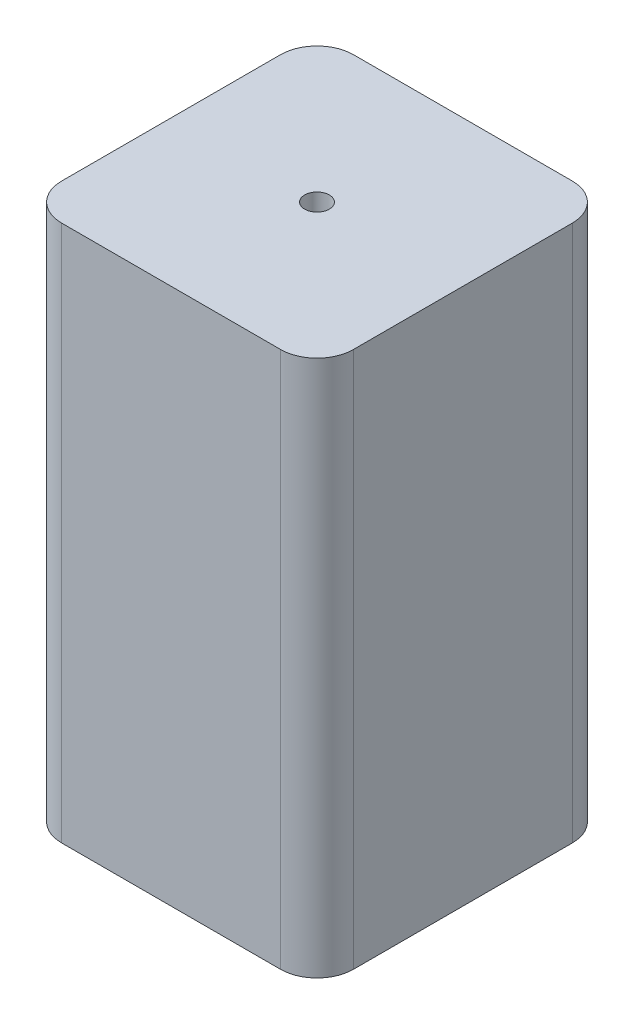
ISO-10303-21;
HEADER;
FILE_DESCRIPTION(('STEP AP214'),'2;1');
FILE_NAME('part.step','',(''),(''),'','','');
FILE_SCHEMA(('AUTOMOTIVE_DESIGN { 1 0 10303 214 1 1 1 1 }'));
ENDSEC;
DATA;
#1=APPLICATION_CONTEXT('core data for automotive mechanical design processes');
#2=APPLICATION_PROTOCOL_DEFINITION('international standard','automotive_design',2000,#1);
#3=PRODUCT_CONTEXT('',#1,'mechanical');
#4=PRODUCT('Part','Part','',(#3));
#5=PRODUCT_RELATED_PRODUCT_CATEGORY('part','',(#4));
#6=PRODUCT_DEFINITION_FORMATION('','',#4);
#7=PRODUCT_DEFINITION_CONTEXT('part definition',#1,'design');
#8=PRODUCT_DEFINITION('design','',#6,#7);
#9=PRODUCT_DEFINITION_SHAPE('','',#8);
#10=(LENGTH_UNIT() NAMED_UNIT(*) SI_UNIT(.MILLI.,.METRE.));
#11=(NAMED_UNIT(*) PLANE_ANGLE_UNIT() SI_UNIT($,.RADIAN.));
#12=(NAMED_UNIT(*) SI_UNIT($,.STERADIAN.) SOLID_ANGLE_UNIT());
#13=UNCERTAINTY_MEASURE_WITH_UNIT(LENGTH_MEASURE(1.E-05),#10,'distance_accuracy_value','');
#14=(GEOMETRIC_REPRESENTATION_CONTEXT(3) GLOBAL_UNCERTAINTY_ASSIGNED_CONTEXT((#13)) GLOBAL_UNIT_ASSIGNED_CONTEXT((#10,
#11,#12)) REPRESENTATION_CONTEXT('',''));
#15=CARTESIAN_POINT('',(0.,0.,0.));
#16=DIRECTION('',(0.,0.,1.));
#17=DIRECTION('',(1.,0.,0.));
#18=AXIS2_PLACEMENT_3D('',#15,#16,#17);
#19=CARTESIAN_POINT('',(-25.,92.,-25.));
#20=DIRECTION('',(1.,0.,0.));
#21=DIRECTION('',(0.,0.,-1.));
#22=AXIS2_PLACEMENT_3D('',#19,#20,#21);
#23=PLANE('',#22);
#24=DIRECTION('',(0.,0.,1.));
#25=VECTOR('',#24,1.);
#26=CARTESIAN_POINT('',(-25.,0.,-25.));
#27=LINE('',#26,#25);
#28=CARTESIAN_POINT('',(-25.,0.,-18.75));
#29=VERTEX_POINT('',#28);
#30=CARTESIAN_POINT('',(-25.,0.,18.75));
#31=VERTEX_POINT('',#30);
#32=EDGE_CURVE('E126',#29,#31,#27,.T.);
#33=ORIENTED_EDGE('',*,*,#32,.T.);
#34=DIRECTION('',(0.,-1.,0.));
#35=VECTOR('',#34,1.);
#36=CARTESIAN_POINT('',(-25.,92.,18.75));
#37=LINE('',#36,#35);
#38=CARTESIAN_POINT('',(-25.,92.,18.75));
#39=VERTEX_POINT('',#38);
#40=EDGE_CURVE('E104',#31,#39,#37,.F.);
#41=ORIENTED_EDGE('',*,*,#40,.T.);
#42=DIRECTION('',(0.,0.,1.));
#43=VECTOR('',#42,1.);
#44=CARTESIAN_POINT('',(-25.,92.,-25.));
#45=LINE('',#44,#43);
#46=CARTESIAN_POINT('',(-25.,92.,-18.75));
#47=VERTEX_POINT('',#46);
#48=EDGE_CURVE('E136',#47,#39,#45,.T.);
#49=ORIENTED_EDGE('',*,*,#48,.F.);
#50=DIRECTION('',(0.,-1.,0.));
#51=VECTOR('',#50,1.);
#52=CARTESIAN_POINT('',(-25.,92.,-18.75));
#53=LINE('',#52,#51);
#54=EDGE_CURVE('E109',#47,#29,#53,.T.);
#55=ORIENTED_EDGE('',*,*,#54,.T.);
#56=EDGE_LOOP('',(#33,#41,#49,#55));
#57=FACE_BOUND('',#56,.T.);
#58=ADVANCED_FACE('F33',(#57),#23,.F.);
#59=CARTESIAN_POINT('',(-25.,92.,25.));
#60=DIRECTION('',(0.,0.,-1.));
#61=DIRECTION('',(-1.,0.,0.));
#62=AXIS2_PLACEMENT_3D('',#59,#60,#61);
#63=PLANE('',#62);
#64=DIRECTION('',(1.,0.,0.));
#65=VECTOR('',#64,1.);
#66=CARTESIAN_POINT('',(-25.,92.,25.));
#67=LINE('',#66,#65);
#68=CARTESIAN_POINT('',(-18.75,92.,25.));
#69=VERTEX_POINT('',#68);
#70=CARTESIAN_POINT('',(18.75,92.,25.));
#71=VERTEX_POINT('',#70);
#72=EDGE_CURVE('E119',#69,#71,#67,.T.);
#73=ORIENTED_EDGE('',*,*,#72,.F.);
#74=DIRECTION('',(0.,-1.,0.));
#75=VECTOR('',#74,1.);
#76=CARTESIAN_POINT('',(-18.75,92.,25.));
#77=LINE('',#76,#75);
#78=CARTESIAN_POINT('',(-18.75,0.,25.));
#79=VERTEX_POINT('',#78);
#80=EDGE_CURVE('E103',#69,#79,#77,.T.);
#81=ORIENTED_EDGE('',*,*,#80,.T.);
#82=DIRECTION('',(1.,0.,0.));
#83=VECTOR('',#82,1.);
#84=CARTESIAN_POINT('',(-25.,0.,25.));
#85=LINE('',#84,#83);
#86=CARTESIAN_POINT('',(18.75,0.,25.));
#87=VERTEX_POINT('',#86);
#88=EDGE_CURVE('E116',#79,#87,#85,.T.);
#89=ORIENTED_EDGE('',*,*,#88,.T.);
#90=DIRECTION('',(0.,-1.,0.));
#91=VECTOR('',#90,1.);
#92=CARTESIAN_POINT('',(18.75,92.,25.));
#93=LINE('',#92,#91);
#94=EDGE_CURVE('E121',#87,#71,#93,.F.);
#95=ORIENTED_EDGE('',*,*,#94,.T.);
#96=EDGE_LOOP('',(#73,#81,#89,#95));
#97=FACE_BOUND('',#96,.T.);
#98=ADVANCED_FACE('F115',(#97),#63,.F.);
#99=CARTESIAN_POINT('',(25.,92.,-25.));
#100=DIRECTION('',(-1.,0.,0.));
#101=DIRECTION('',(0.,0.,1.));
#102=AXIS2_PLACEMENT_3D('',#99,#100,#101);
#103=PLANE('',#102);
#104=DIRECTION('',(0.,0.,-1.));
#105=VECTOR('',#104,1.);
#106=CARTESIAN_POINT('',(25.,0.,-25.));
#107=LINE('',#106,#105);
#108=CARTESIAN_POINT('',(25.,0.,18.75));
#109=VERTEX_POINT('',#108);
#110=CARTESIAN_POINT('',(25.,0.,-18.75));
#111=VERTEX_POINT('',#110);
#112=EDGE_CURVE('E125',#109,#111,#107,.T.);
#113=ORIENTED_EDGE('',*,*,#112,.T.);
#114=DIRECTION('',(0.,-1.,0.));
#115=VECTOR('',#114,1.);
#116=CARTESIAN_POINT('',(25.,92.,-18.75));
#117=LINE('',#116,#115);
#118=CARTESIAN_POINT('',(25.,92.,-18.75));
#119=VERTEX_POINT('',#118);
#120=EDGE_CURVE('E11',#111,#119,#117,.F.);
#121=ORIENTED_EDGE('',*,*,#120,.T.);
#122=DIRECTION('',(0.,0.,-1.));
#123=VECTOR('',#122,1.);
#124=CARTESIAN_POINT('',(25.,92.,-25.));
#125=LINE('',#124,#123);
#126=CARTESIAN_POINT('',(25.,92.,18.75));
#127=VERTEX_POINT('',#126);
#128=EDGE_CURVE('E162',#127,#119,#125,.T.);
#129=ORIENTED_EDGE('',*,*,#128,.F.);
#130=DIRECTION('',(0.,-1.,0.));
#131=VECTOR('',#130,1.);
#132=CARTESIAN_POINT('',(25.,92.,18.75));
#133=LINE('',#132,#131);
#134=EDGE_CURVE('E41',#127,#109,#133,.T.);
#135=ORIENTED_EDGE('',*,*,#134,.T.);
#136=EDGE_LOOP('',(#113,#121,#129,#135));
#137=FACE_BOUND('',#136,.T.);
#138=ADVANCED_FACE('F160',(#137),#103,.F.);
#139=CARTESIAN_POINT('',(-25.,92.,-25.));
#140=DIRECTION('',(0.,0.,1.));
#141=DIRECTION('',(1.,0.,0.));
#142=AXIS2_PLACEMENT_3D('',#139,#140,#141);
#143=PLANE('',#142);
#144=DIRECTION('',(-1.,0.,0.));
#145=VECTOR('',#144,1.);
#146=CARTESIAN_POINT('',(-25.,0.,-25.));
#147=LINE('',#146,#145);
#148=CARTESIAN_POINT('',(18.75,0.,-25.));
#149=VERTEX_POINT('',#148);
#150=CARTESIAN_POINT('',(-18.75,0.,-25.));
#151=VERTEX_POINT('',#150);
#152=EDGE_CURVE('E129',#149,#151,#147,.T.);
#153=ORIENTED_EDGE('',*,*,#152,.T.);
#154=DIRECTION('',(0.,-1.,0.));
#155=VECTOR('',#154,1.);
#156=CARTESIAN_POINT('',(-18.75,92.,-25.));
#157=LINE('',#156,#155);
#158=CARTESIAN_POINT('',(-18.75,92.,-25.));
#159=VERTEX_POINT('',#158);
#160=EDGE_CURVE('E48',#151,#159,#157,.F.);
#161=ORIENTED_EDGE('',*,*,#160,.T.);
#162=DIRECTION('',(-1.,0.,0.));
#163=VECTOR('',#162,1.);
#164=CARTESIAN_POINT('',(-25.,92.,-25.));
#165=LINE('',#164,#163);
#166=CARTESIAN_POINT('',(18.75,92.,-25.));
#167=VERTEX_POINT('',#166);
#168=EDGE_CURVE('E137',#167,#159,#165,.T.);
#169=ORIENTED_EDGE('',*,*,#168,.F.);
#170=DIRECTION('',(0.,-1.,0.));
#171=VECTOR('',#170,1.);
#172=CARTESIAN_POINT('',(18.75,92.,-25.));
#173=LINE('',#172,#171);
#174=EDGE_CURVE('E153',#167,#149,#173,.T.);
#175=ORIENTED_EDGE('',*,*,#174,.T.);
#176=EDGE_LOOP('',(#153,#161,#169,#175));
#177=FACE_BOUND('',#176,.T.);
#178=ADVANCED_FACE('F169',(#177),#143,.F.);
#179=CARTESIAN_POINT('',(0.,92.,0.));
#180=DIRECTION('',(0.,1.,0.));
#181=DIRECTION('',(0.,0.,1.));
#182=AXIS2_PLACEMENT_3D('',#179,#180,#181);
#183=PLANE('',#182);
#184=CARTESIAN_POINT('',(0.,92.,0.));
#185=DIRECTION('',(0.,1.,0.));
#186=DIRECTION('',(0.,0.,1.));
#187=AXIS2_PLACEMENT_3D('',#184,#185,#186);
#188=CIRCLE('',#187,2.115);
#189=CARTESIAN_POINT('',(0.,92.,2.115));
#190=VERTEX_POINT('',#189);
#191=EDGE_CURVE('E176',#190,#190,#188,.T.);
#192=ORIENTED_EDGE('',*,*,#191,.F.);
#193=EDGE_LOOP('',(#192));
#194=FACE_BOUND('',#193,.T.);
#195=ORIENTED_EDGE('',*,*,#48,.T.);
#196=CARTESIAN_POINT('',(-18.75,92.,18.75));
#197=DIRECTION('',(0.,1.,0.));
#198=DIRECTION('',(0.,0.,1.));
#199=AXIS2_PLACEMENT_3D('',#196,#197,#198);
#200=CIRCLE('',#199,6.25);
#201=EDGE_CURVE('E151',#39,#69,#200,.T.);
#202=ORIENTED_EDGE('',*,*,#201,.T.);
#203=ORIENTED_EDGE('',*,*,#72,.T.);
#204=CARTESIAN_POINT('',(18.75,92.,18.75));
#205=DIRECTION('',(0.,1.,0.));
#206=DIRECTION('',(0.,0.,1.));
#207=AXIS2_PLACEMENT_3D('',#204,#205,#206);
#208=CIRCLE('',#207,6.25);
#209=EDGE_CURVE('E146',#71,#127,#208,.T.);
#210=ORIENTED_EDGE('',*,*,#209,.T.);
#211=ORIENTED_EDGE('',*,*,#128,.T.);
#212=CARTESIAN_POINT('',(18.75,92.,-18.75));
#213=DIRECTION('',(0.,1.,0.));
#214=DIRECTION('',(0.,0.,1.));
#215=AXIS2_PLACEMENT_3D('',#212,#213,#214);
#216=CIRCLE('',#215,6.25);
#217=EDGE_CURVE('E55',#119,#167,#216,.T.);
#218=ORIENTED_EDGE('',*,*,#217,.T.);
#219=ORIENTED_EDGE('',*,*,#168,.T.);
#220=CARTESIAN_POINT('',(-18.75,92.,-18.75));
#221=DIRECTION('',(0.,1.,0.));
#222=DIRECTION('',(0.,0.,1.));
#223=AXIS2_PLACEMENT_3D('',#220,#221,#222);
#224=CIRCLE('',#223,6.25);
#225=EDGE_CURVE('E149',#159,#47,#224,.T.);
#226=ORIENTED_EDGE('',*,*,#225,.T.);
#227=EDGE_LOOP('',(#195,#202,#203,#210,#211,#218,#219,#226));
#228=FACE_BOUND('',#227,.T.);
#229=ADVANCED_FACE('F190',(#194,#228),#183,.T.);
#230=CARTESIAN_POINT('',(0.,0.,0.));
#231=DIRECTION('',(0.,1.,0.));
#232=DIRECTION('',(0.,0.,1.));
#233=AXIS2_PLACEMENT_3D('',#230,#231,#232);
#234=PLANE('',#233);
#235=ORIENTED_EDGE('',*,*,#88,.F.);
#236=CARTESIAN_POINT('',(-18.75,0.,18.75));
#237=DIRECTION('',(0.,1.,0.));
#238=DIRECTION('',(0.,0.,1.));
#239=AXIS2_PLACEMENT_3D('',#236,#237,#238);
#240=CIRCLE('',#239,6.25);
#241=EDGE_CURVE('E99',#79,#31,#240,.F.);
#242=ORIENTED_EDGE('',*,*,#241,.T.);
#243=ORIENTED_EDGE('',*,*,#32,.F.);
#244=CARTESIAN_POINT('',(-18.75,0.,-18.75));
#245=DIRECTION('',(0.,1.,0.));
#246=DIRECTION('',(0.,0.,1.));
#247=AXIS2_PLACEMENT_3D('',#244,#245,#246);
#248=CIRCLE('',#247,6.25);
#249=EDGE_CURVE('E110',#29,#151,#248,.F.);
#250=ORIENTED_EDGE('',*,*,#249,.T.);
#251=ORIENTED_EDGE('',*,*,#152,.F.);
#252=CARTESIAN_POINT('',(18.75,0.,-18.75));
#253=DIRECTION('',(0.,1.,0.));
#254=DIRECTION('',(0.,0.,1.));
#255=AXIS2_PLACEMENT_3D('',#252,#253,#254);
#256=CIRCLE('',#255,6.25);
#257=EDGE_CURVE('E140',#149,#111,#256,.F.);
#258=ORIENTED_EDGE('',*,*,#257,.T.);
#259=ORIENTED_EDGE('',*,*,#112,.F.);
#260=CARTESIAN_POINT('',(18.75,0.,18.75));
#261=DIRECTION('',(0.,1.,0.));
#262=DIRECTION('',(0.,0.,1.));
#263=AXIS2_PLACEMENT_3D('',#260,#261,#262);
#264=CIRCLE('',#263,6.25);
#265=EDGE_CURVE('E120',#109,#87,#264,.F.);
#266=ORIENTED_EDGE('',*,*,#265,.T.);
#267=EDGE_LOOP('',(#235,#242,#243,#250,#251,#258,#259,#266));
#268=FACE_BOUND('',#267,.T.);
#269=ADVANCED_FACE('F123',(#268),#234,.F.);
#270=CARTESIAN_POINT('',(0.,72.,0.));
#271=DIRECTION('',(0.,1.,0.));
#272=DIRECTION('',(0.,0.,1.));
#273=AXIS2_PLACEMENT_3D('',#270,#271,#272);
#274=CYLINDRICAL_SURFACE('',#273,2.115);
#275=CARTESIAN_POINT('',(0.,72.,0.));
#276=DIRECTION('',(0.,1.,0.));
#277=DIRECTION('',(0.,0.,1.));
#278=AXIS2_PLACEMENT_3D('',#275,#276,#277);
#279=CIRCLE('',#278,2.115);
#280=CARTESIAN_POINT('',(0.,72.,2.115));
#281=VERTEX_POINT('',#280);
#282=EDGE_CURVE('E131',#281,#281,#279,.T.);
#283=ORIENTED_EDGE('',*,*,#282,.F.);
#284=EDGE_LOOP('',(#283));
#285=FACE_BOUND('',#284,.T.);
#286=ORIENTED_EDGE('',*,*,#191,.T.);
#287=EDGE_LOOP('',(#286));
#288=FACE_BOUND('',#287,.T.);
#289=ADVANCED_FACE('F184',(#285,#288),#274,.F.);
#290=CARTESIAN_POINT('',(0.,72.,0.));
#291=DIRECTION('',(0.,1.,0.));
#292=DIRECTION('',(0.,0.,1.));
#293=AXIS2_PLACEMENT_3D('',#290,#291,#292);
#294=PLANE('',#293);
#295=ORIENTED_EDGE('',*,*,#282,.T.);
#296=EDGE_LOOP('',(#295));
#297=FACE_BOUND('',#296,.T.);
#298=ADVANCED_FACE('F182',(#297),#294,.T.);
#299=CARTESIAN_POINT('',(-18.75,92.,18.75));
#300=DIRECTION('',(0.,-1.,0.));
#301=DIRECTION('',(0.,0.,-1.));
#302=AXIS2_PLACEMENT_3D('',#299,#300,#301);
#303=CYLINDRICAL_SURFACE('',#302,6.25);
#304=ORIENTED_EDGE('',*,*,#201,.F.);
#305=ORIENTED_EDGE('',*,*,#40,.F.);
#306=ORIENTED_EDGE('',*,*,#241,.F.);
#307=ORIENTED_EDGE('',*,*,#80,.F.);
#308=EDGE_LOOP('',(#304,#305,#306,#307));
#309=FACE_BOUND('',#308,.T.);
#310=ADVANCED_FACE('F102',(#309),#303,.T.);
#311=CARTESIAN_POINT('',(-18.75,92.,-18.75));
#312=DIRECTION('',(0.,-1.,0.));
#313=DIRECTION('',(0.,0.,-1.));
#314=AXIS2_PLACEMENT_3D('',#311,#312,#313);
#315=CYLINDRICAL_SURFACE('',#314,6.25);
#316=ORIENTED_EDGE('',*,*,#225,.F.);
#317=ORIENTED_EDGE('',*,*,#160,.F.);
#318=ORIENTED_EDGE('',*,*,#249,.F.);
#319=ORIENTED_EDGE('',*,*,#54,.F.);
#320=EDGE_LOOP('',(#316,#317,#318,#319));
#321=FACE_BOUND('',#320,.T.);
#322=ADVANCED_FACE('F197',(#321),#315,.T.);
#323=CARTESIAN_POINT('',(18.75,92.,-18.75));
#324=DIRECTION('',(0.,-1.,0.));
#325=DIRECTION('',(0.,0.,-1.));
#326=AXIS2_PLACEMENT_3D('',#323,#324,#325);
#327=CYLINDRICAL_SURFACE('',#326,6.25);
#328=ORIENTED_EDGE('',*,*,#217,.F.);
#329=ORIENTED_EDGE('',*,*,#120,.F.);
#330=ORIENTED_EDGE('',*,*,#257,.F.);
#331=ORIENTED_EDGE('',*,*,#174,.F.);
#332=EDGE_LOOP('',(#328,#329,#330,#331));
#333=FACE_BOUND('',#332,.T.);
#334=ADVANCED_FACE('F168',(#333),#327,.T.);
#335=CARTESIAN_POINT('',(18.75,92.,18.75));
#336=DIRECTION('',(0.,-1.,0.));
#337=DIRECTION('',(0.,0.,-1.));
#338=AXIS2_PLACEMENT_3D('',#335,#336,#337);
#339=CYLINDRICAL_SURFACE('',#338,6.25);
#340=ORIENTED_EDGE('',*,*,#209,.F.);
#341=ORIENTED_EDGE('',*,*,#94,.F.);
#342=ORIENTED_EDGE('',*,*,#265,.F.);
#343=ORIENTED_EDGE('',*,*,#134,.F.);
#344=EDGE_LOOP('',(#340,#341,#342,#343));
#345=FACE_BOUND('',#344,.T.);
#346=ADVANCED_FACE('F35',(#345),#339,.T.);
#347=CLOSED_SHELL('',(#58,#98,#138,#178,#229,#269,#289,#298,#310,#322,#334,#346));
#348=MANIFOLD_SOLID_BREP('B2',#347);
#349=ADVANCED_BREP_SHAPE_REPRESENTATION('',(#18,#348),#14);
#350=SHAPE_DEFINITION_REPRESENTATION(#9,#349);
ENDSEC;
END-ISO-10303-21;
